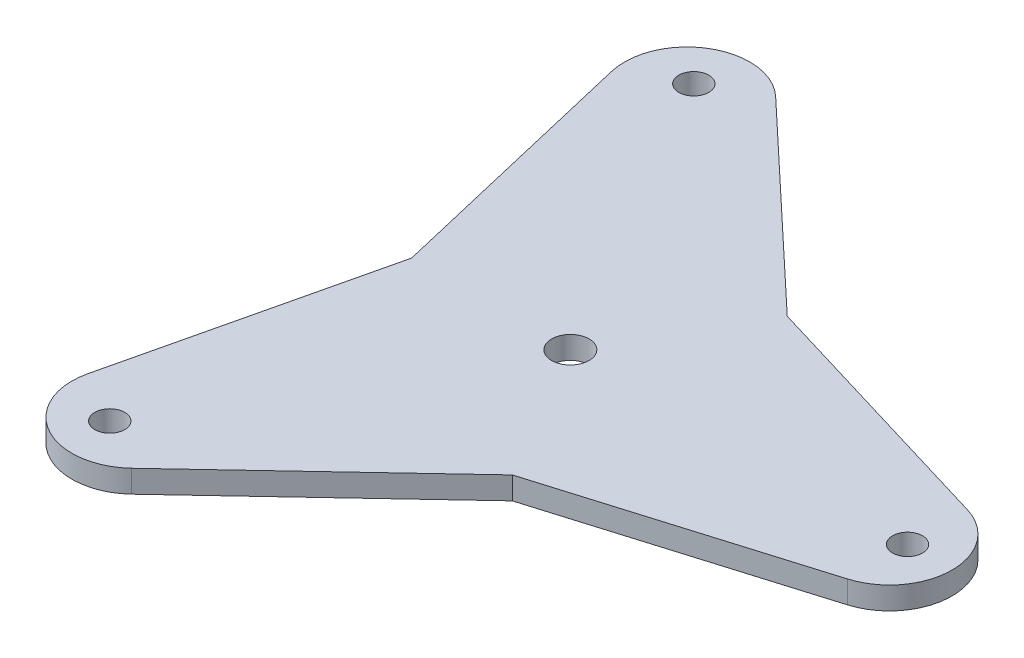
ISO-10303-21;
HEADER;
FILE_DESCRIPTION(('STEP AP214'),'2;1');
FILE_NAME('part.step','',(''),(''),'','','');
FILE_SCHEMA(('AUTOMOTIVE_DESIGN { 1 0 10303 214 1 1 1 1 }'));
ENDSEC;
DATA;
#1=APPLICATION_CONTEXT('core data for automotive mechanical design processes');
#2=APPLICATION_PROTOCOL_DEFINITION('international standard','automotive_design',2000,#1);
#3=PRODUCT_CONTEXT('',#1,'mechanical');
#4=PRODUCT('Part','Part','',(#3));
#5=PRODUCT_RELATED_PRODUCT_CATEGORY('part','',(#4));
#6=PRODUCT_DEFINITION_FORMATION('','',#4);
#7=PRODUCT_DEFINITION_CONTEXT('part definition',#1,'design');
#8=PRODUCT_DEFINITION('design','',#6,#7);
#9=PRODUCT_DEFINITION_SHAPE('','',#8);
#10=(LENGTH_UNIT() NAMED_UNIT(*) SI_UNIT(.MILLI.,.METRE.));
#11=(NAMED_UNIT(*) PLANE_ANGLE_UNIT() SI_UNIT($,.RADIAN.));
#12=(NAMED_UNIT(*) SI_UNIT($,.STERADIAN.) SOLID_ANGLE_UNIT());
#13=UNCERTAINTY_MEASURE_WITH_UNIT(LENGTH_MEASURE(1.E-05),#10,'distance_accuracy_value','');
#14=(GEOMETRIC_REPRESENTATION_CONTEXT(3) GLOBAL_UNCERTAINTY_ASSIGNED_CONTEXT((#13)) GLOBAL_UNIT_ASSIGNED_CONTEXT((#10,
#11,#12)) REPRESENTATION_CONTEXT('',''));
#15=CARTESIAN_POINT('',(0.,0.,0.));
#16=DIRECTION('',(0.,0.,1.));
#17=DIRECTION('',(1.,0.,0.));
#18=AXIS2_PLACEMENT_3D('',#15,#16,#17);
#19=CARTESIAN_POINT('',(-21.2966904512331,3.,36.8869498946027));
#20=DIRECTION('',(0.,-1.,0.));
#21=DIRECTION('',(0.,0.,-1.));
#22=AXIS2_PLACEMENT_3D('',#19,#20,#21);
#23=PLANE('',#22);
#24=DIRECTION('',(0.728283974951013,0.,-0.685275456900036));
#25=VECTOR('',#24,1.);
#26=CARTESIAN_POINT('',(10.5944529670045,3.,18.3501308172507));
#27=LINE('',#26,#25);
#28=CARTESIAN_POINT('',(-15.5717967695517,3.,42.9711431700011));
#29=VERTEX_POINT('',#28);
#30=CARTESIAN_POINT('',(10.5944529670045,3.,18.3501308172507));
#31=VERTEX_POINT('',#30);
#32=EDGE_CURVE('E154',#29,#31,#27,.T.);
#33=ORIENTED_EDGE('',*,*,#32,.T.);
#34=DIRECTION('',(0.957607941740925,0.,-0.288074695026669));
#35=VECTOR('',#34,1.);
#36=CARTESIAN_POINT('',(10.5944529670045,3.,18.3501308172507));
#37=LINE('',#36,#35);
#38=CARTESIAN_POINT('',(44.999999999655,3.,8.00000000000029));
#39=VERTEX_POINT('',#38);
#40=EDGE_CURVE('E97',#31,#39,#37,.T.);
#41=ORIENTED_EDGE('',*,*,#40,.T.);
#42=CARTESIAN_POINT('',(42.5933809024662,3.,0.));
#43=DIRECTION('',(0.,1.,0.));
#44=DIRECTION('',(0.,0.,-1.));
#45=AXIS2_PLACEMENT_3D('',#42,#43,#44);
#46=CIRCLE('',#45,8.35414959639573);
#47=CARTESIAN_POINT('',(44.9999999996551,3.,-8.0000000000003));
#48=VERTEX_POINT('',#47);
#49=EDGE_CURVE('E172',#39,#48,#46,.T.);
#50=ORIENTED_EDGE('',*,*,#49,.T.);
#51=DIRECTION('',(-0.957607941740926,0.,-0.288074695026669));
#52=VECTOR('',#51,1.);
#53=CARTESIAN_POINT('',(10.5944529670045,3.,-18.3501308172507));
#54=LINE('',#53,#52);
#55=CARTESIAN_POINT('',(10.5944529670045,3.,-18.3501308172507));
#56=VERTEX_POINT('',#55);
#57=EDGE_CURVE('E189',#48,#56,#54,.T.);
#58=ORIENTED_EDGE('',*,*,#57,.T.);
#59=DIRECTION('',(-0.728283974951012,0.,-0.685275456900036));
#60=VECTOR('',#59,1.);
#61=CARTESIAN_POINT('',(10.5944529670045,3.,-18.3501308172507));
#62=LINE('',#61,#60);
#63=CARTESIAN_POINT('',(-15.5717967695518,3.,-42.9711431700011));
#64=VERTEX_POINT('',#63);
#65=EDGE_CURVE('E188',#56,#64,#62,.T.);
#66=ORIENTED_EDGE('',*,*,#65,.T.);
#67=CARTESIAN_POINT('',(-21.2966904512331,3.,-36.8869498946027));
#68=DIRECTION('',(0.,1.,0.));
#69=DIRECTION('',(0.,0.,-1.));
#70=AXIS2_PLACEMENT_3D('',#67,#68,#69);
#71=CIRCLE('',#70,8.35414959639573);
#72=CARTESIAN_POINT('',(-29.4282032301033,3.,-34.9711431700009));
#73=VERTEX_POINT('',#72);
#74=EDGE_CURVE('E119',#64,#73,#71,.T.);
#75=ORIENTED_EDGE('',*,*,#74,.T.);
#76=DIRECTION('',(0.229323966789913,0.,0.973350151926705));
#77=VECTOR('',#76,1.);
#78=CARTESIAN_POINT('',(-21.1889059340091,3.,0.));
#79=LINE('',#78,#77);
#80=CARTESIAN_POINT('',(-21.1889059340091,3.,0.));
#81=VERTEX_POINT('',#80);
#82=EDGE_CURVE('E113',#73,#81,#79,.T.);
#83=ORIENTED_EDGE('',*,*,#82,.T.);
#84=DIRECTION('',(-0.229323966789912,0.,0.973350151926705));
#85=VECTOR('',#84,1.);
#86=CARTESIAN_POINT('',(-21.1889059340091,3.,0.));
#87=LINE('',#86,#85);
#88=CARTESIAN_POINT('',(-29.4282032301033,3.,34.9711431700009));
#89=VERTEX_POINT('',#88);
#90=EDGE_CURVE('E117',#81,#89,#87,.T.);
#91=ORIENTED_EDGE('',*,*,#90,.T.);
#92=CARTESIAN_POINT('',(-21.2966904512331,3.,36.8869498946027));
#93=DIRECTION('',(0.,1.,0.));
#94=DIRECTION('',(0.,0.,-1.));
#95=AXIS2_PLACEMENT_3D('',#92,#93,#94);
#96=CIRCLE('',#95,8.35414959639572);
#97=EDGE_CURVE('E51',#89,#29,#96,.T.);
#98=ORIENTED_EDGE('',*,*,#97,.T.);
#99=EDGE_LOOP('',(#33,#41,#50,#58,#66,#75,#83,#91,#98));
#100=FACE_BOUND('',#99,.T.);
#101=CARTESIAN_POINT('',(0.,3.,0.));
#102=DIRECTION('',(0.,1.,0.));
#103=DIRECTION('',(0.,0.,1.));
#104=AXIS2_PLACEMENT_3D('',#101,#102,#103);
#105=CIRCLE('',#104,2.5);
#106=CARTESIAN_POINT('',(0.,3.,2.5));
#107=VERTEX_POINT('',#106);
#108=EDGE_CURVE('E141',#107,#107,#105,.T.);
#109=ORIENTED_EDGE('',*,*,#108,.F.);
#110=EDGE_LOOP('',(#109));
#111=FACE_BOUND('',#110,.T.);
#112=CARTESIAN_POINT('',(-22.50172491,3.,-38.9741308020582));
#113=DIRECTION('',(0.,1.,0.));
#114=DIRECTION('',(0.,0.,1.));
#115=AXIS2_PLACEMENT_3D('',#112,#113,#114);
#116=CIRCLE('',#115,2.);
#117=CARTESIAN_POINT('',(-22.50172491,3.,-36.9741308020582));
#118=VERTEX_POINT('',#117);
#119=EDGE_CURVE('E199',#118,#118,#116,.T.);
#120=ORIENTED_EDGE('',*,*,#119,.F.);
#121=EDGE_LOOP('',(#120));
#122=FACE_BOUND('',#121,.T.);
#123=CARTESIAN_POINT('',(45.00344982,3.,0.));
#124=DIRECTION('',(0.,1.,0.));
#125=DIRECTION('',(0.,0.,1.));
#126=AXIS2_PLACEMENT_3D('',#123,#124,#125);
#127=CIRCLE('',#126,2.);
#128=CARTESIAN_POINT('',(45.00344982,3.,2.00000000000001));
#129=VERTEX_POINT('',#128);
#130=EDGE_CURVE('E205',#129,#129,#127,.T.);
#131=ORIENTED_EDGE('',*,*,#130,.F.);
#132=EDGE_LOOP('',(#131));
#133=FACE_BOUND('',#132,.T.);
#134=CARTESIAN_POINT('',(-22.50172491,3.,38.9741308020582));
#135=DIRECTION('',(0.,1.,0.));
#136=DIRECTION('',(0.,0.,1.));
#137=AXIS2_PLACEMENT_3D('',#134,#135,#136);
#138=CIRCLE('',#137,2.);
#139=CARTESIAN_POINT('',(-22.50172491,3.,40.9741308020582));
#140=VERTEX_POINT('',#139);
#141=EDGE_CURVE('E211',#140,#140,#138,.T.);
#142=ORIENTED_EDGE('',*,*,#141,.F.);
#143=EDGE_LOOP('',(#142));
#144=FACE_BOUND('',#143,.T.);
#145=ADVANCED_FACE('F34',(#100,#111,#122,#133,#144),#23,.F.);
#146=CARTESIAN_POINT('',(-21.2966904512331,0.,36.8869498946027));
#147=DIRECTION('',(0.,-1.,0.));
#148=DIRECTION('',(0.,0.,-1.));
#149=AXIS2_PLACEMENT_3D('',#146,#147,#148);
#150=PLANE('',#149);
#151=CARTESIAN_POINT('',(45.00344982,0.,0.));
#152=DIRECTION('',(0.,1.,0.));
#153=DIRECTION('',(0.,0.,1.));
#154=AXIS2_PLACEMENT_3D('',#151,#152,#153);
#155=CIRCLE('',#154,2.);
#156=CARTESIAN_POINT('',(45.00344982,0.,2.00000000000001));
#157=VERTEX_POINT('',#156);
#158=EDGE_CURVE('E208',#157,#157,#155,.T.);
#159=ORIENTED_EDGE('',*,*,#158,.T.);
#160=EDGE_LOOP('',(#159));
#161=FACE_BOUND('',#160,.T.);
#162=CARTESIAN_POINT('',(0.,0.,0.));
#163=DIRECTION('',(0.,1.,0.));
#164=DIRECTION('',(0.,0.,1.));
#165=AXIS2_PLACEMENT_3D('',#162,#163,#164);
#166=CIRCLE('',#165,2.5);
#167=CARTESIAN_POINT('',(0.,0.,2.5));
#168=VERTEX_POINT('',#167);
#169=EDGE_CURVE('E196',#168,#168,#166,.T.);
#170=ORIENTED_EDGE('',*,*,#169,.T.);
#171=EDGE_LOOP('',(#170));
#172=FACE_BOUND('',#171,.T.);
#173=DIRECTION('',(0.728283974951013,0.,-0.685275456900036));
#174=VECTOR('',#173,1.);
#175=CARTESIAN_POINT('',(10.5944529670045,0.,18.3501308172507));
#176=LINE('',#175,#174);
#177=CARTESIAN_POINT('',(-15.5717967695517,0.,42.9711431700011));
#178=VERTEX_POINT('',#177);
#179=CARTESIAN_POINT('',(10.5944529670045,0.,18.3501308172507));
#180=VERTEX_POINT('',#179);
#181=EDGE_CURVE('E137',#178,#180,#176,.T.);
#182=ORIENTED_EDGE('',*,*,#181,.F.);
#183=CARTESIAN_POINT('',(-21.2966904512331,0.,36.8869498946027));
#184=DIRECTION('',(0.,1.,0.));
#185=DIRECTION('',(0.,0.,-1.));
#186=AXIS2_PLACEMENT_3D('',#183,#184,#185);
#187=CIRCLE('',#186,8.35414959639572);
#188=CARTESIAN_POINT('',(-29.4282032301033,0.,34.9711431700009));
#189=VERTEX_POINT('',#188);
#190=EDGE_CURVE('E89',#189,#178,#187,.T.);
#191=ORIENTED_EDGE('',*,*,#190,.F.);
#192=DIRECTION('',(-0.229323966789912,0.,0.973350151926705));
#193=VECTOR('',#192,1.);
#194=CARTESIAN_POINT('',(-21.1889059340091,0.,0.));
#195=LINE('',#194,#193);
#196=CARTESIAN_POINT('',(-21.1889059340091,0.,0.));
#197=VERTEX_POINT('',#196);
#198=EDGE_CURVE('E83',#197,#189,#195,.T.);
#199=ORIENTED_EDGE('',*,*,#198,.F.);
#200=DIRECTION('',(0.229323966789913,0.,0.973350151926705));
#201=VECTOR('',#200,1.);
#202=CARTESIAN_POINT('',(-21.1889059340091,0.,0.));
#203=LINE('',#202,#201);
#204=CARTESIAN_POINT('',(-29.4282032301033,0.,-34.9711431700009));
#205=VERTEX_POINT('',#204);
#206=EDGE_CURVE('E127',#205,#197,#203,.T.);
#207=ORIENTED_EDGE('',*,*,#206,.F.);
#208=CARTESIAN_POINT('',(-21.2966904512331,0.,-36.8869498946027));
#209=DIRECTION('',(0.,1.,0.));
#210=DIRECTION('',(0.,0.,-1.));
#211=AXIS2_PLACEMENT_3D('',#208,#209,#210);
#212=CIRCLE('',#211,8.35414959639573);
#213=CARTESIAN_POINT('',(-15.5717967695518,0.,-42.9711431700011));
#214=VERTEX_POINT('',#213);
#215=EDGE_CURVE('E149',#214,#205,#212,.T.);
#216=ORIENTED_EDGE('',*,*,#215,.F.);
#217=DIRECTION('',(-0.728283974951012,0.,-0.685275456900036));
#218=VECTOR('',#217,1.);
#219=CARTESIAN_POINT('',(10.5944529670045,0.,-18.3501308172507));
#220=LINE('',#219,#218);
#221=CARTESIAN_POINT('',(10.5944529670045,0.,-18.3501308172507));
#222=VERTEX_POINT('',#221);
#223=EDGE_CURVE('E147',#222,#214,#220,.T.);
#224=ORIENTED_EDGE('',*,*,#223,.F.);
#225=DIRECTION('',(-0.957607941740926,0.,-0.288074695026669));
#226=VECTOR('',#225,1.);
#227=CARTESIAN_POINT('',(10.5944529670045,0.,-18.3501308172507));
#228=LINE('',#227,#226);
#229=CARTESIAN_POINT('',(44.9999999996551,0.,-8.0000000000003));
#230=VERTEX_POINT('',#229);
#231=EDGE_CURVE('E145',#230,#222,#228,.T.);
#232=ORIENTED_EDGE('',*,*,#231,.F.);
#233=CARTESIAN_POINT('',(42.5933809024662,0.,0.));
#234=DIRECTION('',(0.,1.,0.));
#235=DIRECTION('',(0.,0.,-1.));
#236=AXIS2_PLACEMENT_3D('',#233,#234,#235);
#237=CIRCLE('',#236,8.35414959639573);
#238=CARTESIAN_POINT('',(44.999999999655,0.,8.00000000000029));
#239=VERTEX_POINT('',#238);
#240=EDGE_CURVE('E143',#239,#230,#237,.T.);
#241=ORIENTED_EDGE('',*,*,#240,.F.);
#242=DIRECTION('',(0.957607941740925,0.,-0.288074695026669));
#243=VECTOR('',#242,1.);
#244=CARTESIAN_POINT('',(10.5944529670045,0.,18.3501308172507));
#245=LINE('',#244,#243);
#246=EDGE_CURVE('E140',#180,#239,#245,.T.);
#247=ORIENTED_EDGE('',*,*,#246,.F.);
#248=EDGE_LOOP('',(#182,#191,#199,#207,#216,#224,#232,#241,#247));
#249=FACE_BOUND('',#248,.T.);
#250=CARTESIAN_POINT('',(-22.50172491,0.,-38.9741308020582));
#251=DIRECTION('',(0.,1.,0.));
#252=DIRECTION('',(0.,0.,1.));
#253=AXIS2_PLACEMENT_3D('',#250,#251,#252);
#254=CIRCLE('',#253,2.);
#255=CARTESIAN_POINT('',(-22.50172491,0.,-36.9741308020582));
#256=VERTEX_POINT('',#255);
#257=EDGE_CURVE('E202',#256,#256,#254,.T.);
#258=ORIENTED_EDGE('',*,*,#257,.T.);
#259=EDGE_LOOP('',(#258));
#260=FACE_BOUND('',#259,.T.);
#261=CARTESIAN_POINT('',(-22.50172491,0.,38.9741308020582));
#262=DIRECTION('',(0.,1.,0.));
#263=DIRECTION('',(0.,0.,1.));
#264=AXIS2_PLACEMENT_3D('',#261,#262,#263);
#265=CIRCLE('',#264,2.);
#266=CARTESIAN_POINT('',(-22.50172491,0.,40.9741308020582));
#267=VERTEX_POINT('',#266);
#268=EDGE_CURVE('E214',#267,#267,#265,.T.);
#269=ORIENTED_EDGE('',*,*,#268,.T.);
#270=EDGE_LOOP('',(#269));
#271=FACE_BOUND('',#270,.T.);
#272=ADVANCED_FACE('F176',(#161,#172,#249,#260,#271),#150,.T.);
#273=CARTESIAN_POINT('',(10.5944529670045,3.,18.3501308172507));
#274=DIRECTION('',(-0.685275456900036,0.,-0.728283974951013));
#275=DIRECTION('',(-0.728283974951013,0.,0.685275456900036));
#276=AXIS2_PLACEMENT_3D('',#273,#274,#275);
#277=PLANE('',#276);
#278=ORIENTED_EDGE('',*,*,#181,.T.);
#279=DIRECTION('',(0.,-1.,0.));
#280=VECTOR('',#279,1.);
#281=CARTESIAN_POINT('',(10.5944529670045,3.,18.3501308172507));
#282=LINE('',#281,#280);
#283=EDGE_CURVE('E11',#31,#180,#282,.T.);
#284=ORIENTED_EDGE('',*,*,#283,.F.);
#285=ORIENTED_EDGE('',*,*,#32,.F.);
#286=DIRECTION('',(0.,-1.,0.));
#287=VECTOR('',#286,1.);
#288=CARTESIAN_POINT('',(-15.5717967695517,3.,42.9711431700011));
#289=LINE('',#288,#287);
#290=EDGE_CURVE('E133',#29,#178,#289,.T.);
#291=ORIENTED_EDGE('',*,*,#290,.T.);
#292=EDGE_LOOP('',(#278,#284,#285,#291));
#293=FACE_BOUND('',#292,.T.);
#294=ADVANCED_FACE('F36',(#293),#277,.F.);
#295=CARTESIAN_POINT('',(10.5944529670045,3.,18.3501308172507));
#296=DIRECTION('',(-0.288074695026669,0.,-0.957607941740925));
#297=DIRECTION('',(-0.957607941740925,0.,0.288074695026669));
#298=AXIS2_PLACEMENT_3D('',#295,#296,#297);
#299=PLANE('',#298);
#300=ORIENTED_EDGE('',*,*,#246,.T.);
#301=DIRECTION('',(0.,-1.,0.));
#302=VECTOR('',#301,1.);
#303=CARTESIAN_POINT('',(44.999999999655,3.,8.00000000000029));
#304=LINE('',#303,#302);
#305=EDGE_CURVE('E43',#39,#239,#304,.T.);
#306=ORIENTED_EDGE('',*,*,#305,.F.);
#307=ORIENTED_EDGE('',*,*,#40,.F.);
#308=ORIENTED_EDGE('',*,*,#283,.T.);
#309=EDGE_LOOP('',(#300,#306,#307,#308));
#310=FACE_BOUND('',#309,.T.);
#311=ADVANCED_FACE('F250',(#310),#299,.F.);
#312=CARTESIAN_POINT('',(42.5933809024662,3.,0.));
#313=DIRECTION('',(0.,-1.,0.));
#314=DIRECTION('',(0.,0.,-1.));
#315=AXIS2_PLACEMENT_3D('',#312,#313,#314);
#316=CYLINDRICAL_SURFACE('',#315,8.35414959639573);
#317=ORIENTED_EDGE('',*,*,#240,.T.);
#318=DIRECTION('',(0.,-1.,0.));
#319=VECTOR('',#318,1.);
#320=CARTESIAN_POINT('',(44.9999999996551,3.,-8.0000000000003));
#321=LINE('',#320,#319);
#322=EDGE_CURVE('E164',#48,#230,#321,.T.);
#323=ORIENTED_EDGE('',*,*,#322,.F.);
#324=ORIENTED_EDGE('',*,*,#49,.F.);
#325=ORIENTED_EDGE('',*,*,#305,.T.);
#326=EDGE_LOOP('',(#317,#323,#324,#325));
#327=FACE_BOUND('',#326,.T.);
#328=ADVANCED_FACE('F170',(#327),#316,.T.);
#329=CARTESIAN_POINT('',(10.5944529670045,3.,-18.3501308172507));
#330=DIRECTION('',(-0.288074695026668,0.,0.957607941740925));
#331=DIRECTION('',(0.957607941740926,0.,0.288074695026669));
#332=AXIS2_PLACEMENT_3D('',#329,#330,#331);
#333=PLANE('',#332);
#334=ORIENTED_EDGE('',*,*,#231,.T.);
#335=DIRECTION('',(0.,-1.,0.));
#336=VECTOR('',#335,1.);
#337=CARTESIAN_POINT('',(10.5944529670045,3.,-18.3501308172507));
#338=LINE('',#337,#336);
#339=EDGE_CURVE('E161',#56,#222,#338,.T.);
#340=ORIENTED_EDGE('',*,*,#339,.F.);
#341=ORIENTED_EDGE('',*,*,#57,.F.);
#342=ORIENTED_EDGE('',*,*,#322,.T.);
#343=EDGE_LOOP('',(#334,#340,#341,#342));
#344=FACE_BOUND('',#343,.T.);
#345=ADVANCED_FACE('F182',(#344),#333,.F.);
#346=CARTESIAN_POINT('',(10.5944529670045,3.,-18.3501308172507));
#347=DIRECTION('',(-0.685275456900036,0.,0.728283974951012));
#348=DIRECTION('',(0.728283974951012,0.,0.685275456900036));
#349=AXIS2_PLACEMENT_3D('',#346,#347,#348);
#350=PLANE('',#349);
#351=ORIENTED_EDGE('',*,*,#223,.T.);
#352=DIRECTION('',(0.,-1.,0.));
#353=VECTOR('',#352,1.);
#354=CARTESIAN_POINT('',(-15.5717967695518,3.,-42.9711431700011));
#355=LINE('',#354,#353);
#356=EDGE_CURVE('E158',#64,#214,#355,.T.);
#357=ORIENTED_EDGE('',*,*,#356,.F.);
#358=ORIENTED_EDGE('',*,*,#65,.F.);
#359=ORIENTED_EDGE('',*,*,#339,.T.);
#360=EDGE_LOOP('',(#351,#357,#358,#359));
#361=FACE_BOUND('',#360,.T.);
#362=ADVANCED_FACE('F186',(#361),#350,.F.);
#363=CARTESIAN_POINT('',(-21.2966904512331,3.,-36.8869498946027));
#364=DIRECTION('',(0.,-1.,0.));
#365=DIRECTION('',(0.,0.,-1.));
#366=AXIS2_PLACEMENT_3D('',#363,#364,#365);
#367=CYLINDRICAL_SURFACE('',#366,8.35414959639573);
#368=ORIENTED_EDGE('',*,*,#215,.T.);
#369=DIRECTION('',(0.,-1.,0.));
#370=VECTOR('',#369,1.);
#371=CARTESIAN_POINT('',(-29.4282032301033,3.,-34.9711431700009));
#372=LINE('',#371,#370);
#373=EDGE_CURVE('E128',#73,#205,#372,.T.);
#374=ORIENTED_EDGE('',*,*,#373,.F.);
#375=ORIENTED_EDGE('',*,*,#74,.F.);
#376=ORIENTED_EDGE('',*,*,#356,.T.);
#377=EDGE_LOOP('',(#368,#374,#375,#376));
#378=FACE_BOUND('',#377,.T.);
#379=ADVANCED_FACE('F241',(#378),#367,.T.);
#380=CARTESIAN_POINT('',(-21.1889059340091,3.,0.));
#381=DIRECTION('',(0.973350151926704,0.,-0.229323966789913));
#382=DIRECTION('',(-0.229323966789913,0.,-0.973350151926705));
#383=AXIS2_PLACEMENT_3D('',#380,#381,#382);
#384=PLANE('',#383);
#385=ORIENTED_EDGE('',*,*,#206,.T.);
#386=DIRECTION('',(0.,-1.,0.));
#387=VECTOR('',#386,1.);
#388=CARTESIAN_POINT('',(-21.1889059340091,3.,0.));
#389=LINE('',#388,#387);
#390=EDGE_CURVE('E124',#81,#197,#389,.T.);
#391=ORIENTED_EDGE('',*,*,#390,.F.);
#392=ORIENTED_EDGE('',*,*,#82,.F.);
#393=ORIENTED_EDGE('',*,*,#373,.T.);
#394=EDGE_LOOP('',(#385,#391,#392,#393));
#395=FACE_BOUND('',#394,.T.);
#396=ADVANCED_FACE('F125',(#395),#384,.F.);
#397=CARTESIAN_POINT('',(-21.1889059340091,3.,0.));
#398=DIRECTION('',(0.973350151926705,0.,0.229323966789912));
#399=DIRECTION('',(0.229323966789912,0.,-0.973350151926705));
#400=AXIS2_PLACEMENT_3D('',#397,#398,#399);
#401=PLANE('',#400);
#402=ORIENTED_EDGE('',*,*,#198,.T.);
#403=DIRECTION('',(0.,-1.,0.));
#404=VECTOR('',#403,1.);
#405=CARTESIAN_POINT('',(-29.4282032301033,3.,34.9711431700009));
#406=LINE('',#405,#404);
#407=EDGE_CURVE('E129',#89,#189,#406,.T.);
#408=ORIENTED_EDGE('',*,*,#407,.F.);
#409=ORIENTED_EDGE('',*,*,#90,.F.);
#410=ORIENTED_EDGE('',*,*,#390,.T.);
#411=EDGE_LOOP('',(#402,#408,#409,#410));
#412=FACE_BOUND('',#411,.T.);
#413=ADVANCED_FACE('F131',(#412),#401,.F.);
#414=CARTESIAN_POINT('',(-21.2966904512331,3.,36.8869498946027));
#415=DIRECTION('',(0.,-1.,0.));
#416=DIRECTION('',(0.,0.,-1.));
#417=AXIS2_PLACEMENT_3D('',#414,#415,#416);
#418=CYLINDRICAL_SURFACE('',#417,8.35414959639572);
#419=ORIENTED_EDGE('',*,*,#190,.T.);
#420=ORIENTED_EDGE('',*,*,#290,.F.);
#421=ORIENTED_EDGE('',*,*,#97,.F.);
#422=ORIENTED_EDGE('',*,*,#407,.T.);
#423=EDGE_LOOP('',(#419,#420,#421,#422));
#424=FACE_BOUND('',#423,.T.);
#425=ADVANCED_FACE('F234',(#424),#418,.T.);
#426=CARTESIAN_POINT('',(0.,3.,0.));
#427=DIRECTION('',(0.,-1.,0.));
#428=DIRECTION('',(0.,0.,-1.));
#429=AXIS2_PLACEMENT_3D('',#426,#427,#428);
#430=CYLINDRICAL_SURFACE('',#429,2.5);
#431=ORIENTED_EDGE('',*,*,#108,.T.);
#432=EDGE_LOOP('',(#431));
#433=FACE_BOUND('',#432,.T.);
#434=ORIENTED_EDGE('',*,*,#169,.F.);
#435=EDGE_LOOP('',(#434));
#436=FACE_BOUND('',#435,.T.);
#437=ADVANCED_FACE('F231',(#433,#436),#430,.F.);
#438=CARTESIAN_POINT('',(-22.50172491,3.,-38.9741308020582));
#439=DIRECTION('',(0.,-1.,0.));
#440=DIRECTION('',(0.,0.,-1.));
#441=AXIS2_PLACEMENT_3D('',#438,#439,#440);
#442=CYLINDRICAL_SURFACE('',#441,2.);
#443=ORIENTED_EDGE('',*,*,#119,.T.);
#444=EDGE_LOOP('',(#443));
#445=FACE_BOUND('',#444,.T.);
#446=ORIENTED_EDGE('',*,*,#257,.F.);
#447=EDGE_LOOP('',(#446));
#448=FACE_BOUND('',#447,.T.);
#449=ADVANCED_FACE('F319',(#445,#448),#442,.F.);
#450=CARTESIAN_POINT('',(45.00344982,3.,0.));
#451=DIRECTION('',(0.,-1.,0.));
#452=DIRECTION('',(0.,0.,-1.));
#453=AXIS2_PLACEMENT_3D('',#450,#451,#452);
#454=CYLINDRICAL_SURFACE('',#453,2.);
#455=ORIENTED_EDGE('',*,*,#130,.T.);
#456=EDGE_LOOP('',(#455));
#457=FACE_BOUND('',#456,.T.);
#458=ORIENTED_EDGE('',*,*,#158,.F.);
#459=EDGE_LOOP('',(#458));
#460=FACE_BOUND('',#459,.T.);
#461=ADVANCED_FACE('F327',(#457,#460),#454,.F.);
#462=CARTESIAN_POINT('',(-22.50172491,3.,38.9741308020582));
#463=DIRECTION('',(0.,-1.,0.));
#464=DIRECTION('',(0.,0.,-1.));
#465=AXIS2_PLACEMENT_3D('',#462,#463,#464);
#466=CYLINDRICAL_SURFACE('',#465,2.);
#467=ORIENTED_EDGE('',*,*,#141,.T.);
#468=EDGE_LOOP('',(#467));
#469=FACE_BOUND('',#468,.T.);
#470=ORIENTED_EDGE('',*,*,#268,.F.);
#471=EDGE_LOOP('',(#470));
#472=FACE_BOUND('',#471,.T.);
#473=ADVANCED_FACE('F220',(#469,#472),#466,.F.);
#474=CLOSED_SHELL('',(#145,#272,#294,#311,#328,#345,#362,#379,#396,#413,#425,#437,#449,#461,#473));
#475=MANIFOLD_SOLID_BREP('B2',#474);
#476=ADVANCED_BREP_SHAPE_REPRESENTATION('',(#18,#475),#14);
#477=SHAPE_DEFINITION_REPRESENTATION(#9,#476);
ENDSEC;
END-ISO-10303-21;
